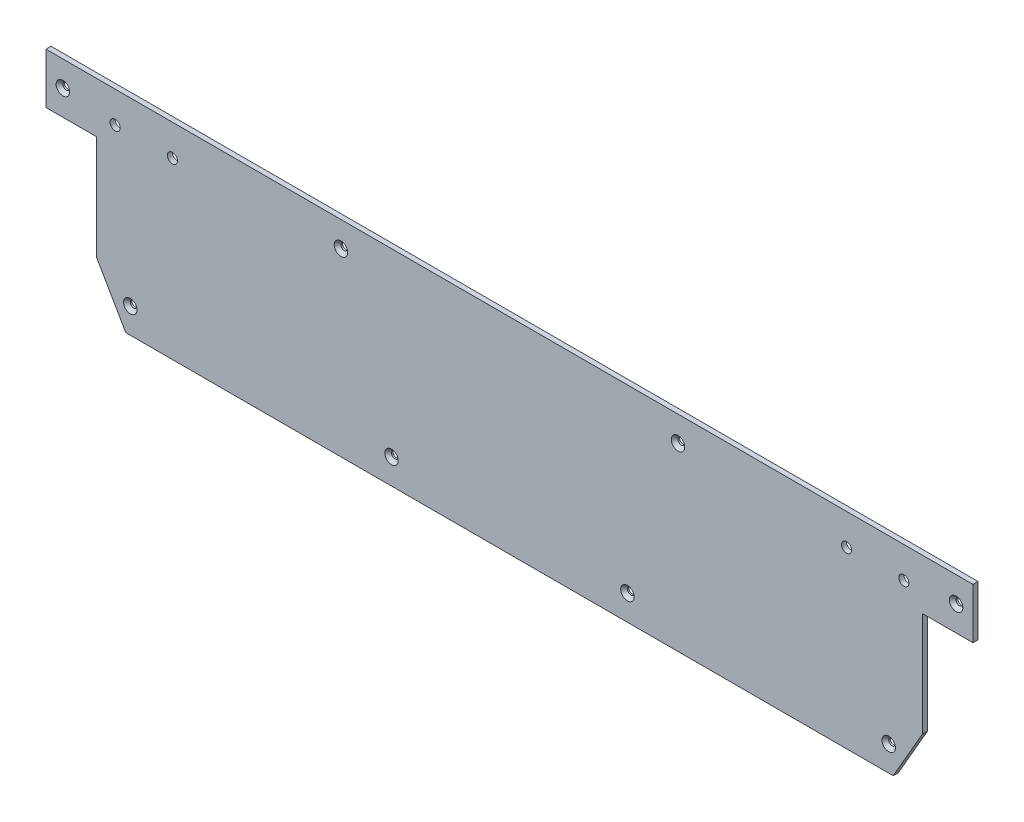
ISO-10303-21;
HEADER;
FILE_DESCRIPTION(('STEP AP214'),'2;1');
FILE_NAME('part.step','',(''),(''),'','','');
FILE_SCHEMA(('AUTOMOTIVE_DESIGN { 1 0 10303 214 1 1 1 1 }'));
ENDSEC;
DATA;
#1=APPLICATION_CONTEXT('core data for automotive mechanical design processes');
#2=APPLICATION_PROTOCOL_DEFINITION('international standard','automotive_design',2000,#1);
#3=PRODUCT_CONTEXT('',#1,'mechanical');
#4=PRODUCT('Part','Part','',(#3));
#5=PRODUCT_RELATED_PRODUCT_CATEGORY('part','',(#4));
#6=PRODUCT_DEFINITION_FORMATION('','',#4);
#7=PRODUCT_DEFINITION_CONTEXT('part definition',#1,'design');
#8=PRODUCT_DEFINITION('design','',#6,#7);
#9=PRODUCT_DEFINITION_SHAPE('','',#8);
#10=(LENGTH_UNIT() NAMED_UNIT(*) SI_UNIT(.MILLI.,.METRE.));
#11=(NAMED_UNIT(*) PLANE_ANGLE_UNIT() SI_UNIT($,.RADIAN.));
#12=(NAMED_UNIT(*) SI_UNIT($,.STERADIAN.) SOLID_ANGLE_UNIT());
#13=UNCERTAINTY_MEASURE_WITH_UNIT(LENGTH_MEASURE(1.E-05),#10,'distance_accuracy_value','');
#14=(GEOMETRIC_REPRESENTATION_CONTEXT(3) GLOBAL_UNCERTAINTY_ASSIGNED_CONTEXT((#13)) GLOBAL_UNIT_ASSIGNED_CONTEXT((#10,
#11,#12)) REPRESENTATION_CONTEXT('',''));
#15=CARTESIAN_POINT('',(0.,0.,0.));
#16=DIRECTION('',(0.,0.,1.));
#17=DIRECTION('',(1.,0.,0.));
#18=AXIS2_PLACEMENT_3D('',#15,#16,#17);
#19=CARTESIAN_POINT('',(-275.,61.,3.));
#20=DIRECTION('',(1.,0.,0.));
#21=DIRECTION('',(0.,0.,-1.));
#22=AXIS2_PLACEMENT_3D('',#19,#20,#21);
#23=PLANE('',#22);
#24=DIRECTION('',(0.,-1.,0.));
#25=VECTOR('',#24,1.);
#26=CARTESIAN_POINT('',(-275.,61.,0.));
#27=LINE('',#26,#25);
#28=CARTESIAN_POINT('',(-275.,61.,0.));
#29=VERTEX_POINT('',#28);
#30=CARTESIAN_POINT('',(-275.,31.,0.));
#31=VERTEX_POINT('',#30);
#32=EDGE_CURVE('E138',#29,#31,#27,.T.);
#33=ORIENTED_EDGE('',*,*,#32,.T.);
#34=DIRECTION('',(0.,0.,1.));
#35=VECTOR('',#34,1.);
#36=CARTESIAN_POINT('',(-275.,31.,0.));
#37=LINE('',#36,#35);
#38=CARTESIAN_POINT('',(-275.,31.,3.));
#39=VERTEX_POINT('',#38);
#40=EDGE_CURVE('E143',#31,#39,#37,.T.);
#41=ORIENTED_EDGE('',*,*,#40,.T.);
#42=DIRECTION('',(0.,-1.,0.));
#43=VECTOR('',#42,1.);
#44=CARTESIAN_POINT('',(-275.,61.,3.));
#45=LINE('',#44,#43);
#46=CARTESIAN_POINT('',(-275.,61.,3.));
#47=VERTEX_POINT('',#46);
#48=EDGE_CURVE('E148',#47,#39,#45,.T.);
#49=ORIENTED_EDGE('',*,*,#48,.F.);
#50=DIRECTION('',(0.,0.,-1.));
#51=VECTOR('',#50,1.);
#52=CARTESIAN_POINT('',(-275.,61.,3.));
#53=LINE('',#52,#51);
#54=EDGE_CURVE('E149',#47,#29,#53,.T.);
#55=ORIENTED_EDGE('',*,*,#54,.T.);
#56=EDGE_LOOP('',(#33,#41,#49,#55));
#57=FACE_BOUND('',#56,.T.);
#58=ADVANCED_FACE('F36',(#57),#23,.F.);
#59=CARTESIAN_POINT('',(-275.,-61.,3.));
#60=DIRECTION('',(0.,1.,0.));
#61=DIRECTION('',(0.,0.,1.));
#62=AXIS2_PLACEMENT_3D('',#59,#60,#61);
#63=PLANE('',#62);
#64=DIRECTION('',(1.,0.,0.));
#65=VECTOR('',#64,1.);
#66=CARTESIAN_POINT('',(-275.,-61.,3.));
#67=LINE('',#66,#65);
#68=CARTESIAN_POINT('',(-227.679491924311,-61.,3.));
#69=VERTEX_POINT('',#68);
#70=CARTESIAN_POINT('',(227.679491924311,-60.9999999999999,3.));
#71=VERTEX_POINT('',#70);
#72=EDGE_CURVE('E131',#69,#71,#67,.T.);
#73=ORIENTED_EDGE('',*,*,#72,.F.);
#74=DIRECTION('',(0.,0.,1.));
#75=VECTOR('',#74,1.);
#76=CARTESIAN_POINT('',(-227.679491924311,-61.,0.));
#77=LINE('',#76,#75);
#78=CARTESIAN_POINT('',(-227.679491924311,-61.,0.));
#79=VERTEX_POINT('',#78);
#80=EDGE_CURVE('E118',#79,#69,#77,.T.);
#81=ORIENTED_EDGE('',*,*,#80,.F.);
#82=DIRECTION('',(1.,0.,0.));
#83=VECTOR('',#82,1.);
#84=CARTESIAN_POINT('',(-275.,-61.,0.));
#85=LINE('',#84,#83);
#86=CARTESIAN_POINT('',(227.679491924311,-61.,0.));
#87=VERTEX_POINT('',#86);
#88=EDGE_CURVE('E129',#79,#87,#85,.T.);
#89=ORIENTED_EDGE('',*,*,#88,.T.);
#90=DIRECTION('',(0.,0.,1.));
#91=VECTOR('',#90,1.);
#92=CARTESIAN_POINT('',(227.679491924311,-60.9999999999999,0.));
#93=LINE('',#92,#91);
#94=EDGE_CURVE('E60',#87,#71,#93,.T.);
#95=ORIENTED_EDGE('',*,*,#94,.T.);
#96=EDGE_LOOP('',(#73,#81,#89,#95));
#97=FACE_BOUND('',#96,.T.);
#98=ADVANCED_FACE('F128',(#97),#63,.F.);
#99=CARTESIAN_POINT('',(275.,61.,3.));
#100=DIRECTION('',(-1.,0.,0.));
#101=DIRECTION('',(0.,0.,1.));
#102=AXIS2_PLACEMENT_3D('',#99,#100,#101);
#103=PLANE('',#102);
#104=DIRECTION('',(0.,1.,0.));
#105=VECTOR('',#104,1.);
#106=CARTESIAN_POINT('',(275.,61.,3.));
#107=LINE('',#106,#105);
#108=CARTESIAN_POINT('',(275.,31.0000000000001,3.));
#109=VERTEX_POINT('',#108);
#110=CARTESIAN_POINT('',(275.,61.,3.));
#111=VERTEX_POINT('',#110);
#112=EDGE_CURVE('E273',#109,#111,#107,.T.);
#113=ORIENTED_EDGE('',*,*,#112,.F.);
#114=DIRECTION('',(0.,0.,1.));
#115=VECTOR('',#114,1.);
#116=CARTESIAN_POINT('',(275.,31.0000000000001,0.));
#117=LINE('',#116,#115);
#118=CARTESIAN_POINT('',(275.,31.0000000000001,0.));
#119=VERTEX_POINT('',#118);
#120=EDGE_CURVE('E267',#119,#109,#117,.T.);
#121=ORIENTED_EDGE('',*,*,#120,.F.);
#122=DIRECTION('',(0.,1.,0.));
#123=VECTOR('',#122,1.);
#124=CARTESIAN_POINT('',(275.,61.,0.));
#125=LINE('',#124,#123);
#126=CARTESIAN_POINT('',(275.,61.,0.));
#127=VERTEX_POINT('',#126);
#128=EDGE_CURVE('E137',#119,#127,#125,.T.);
#129=ORIENTED_EDGE('',*,*,#128,.T.);
#130=DIRECTION('',(0.,0.,-1.));
#131=VECTOR('',#130,1.);
#132=CARTESIAN_POINT('',(275.,61.,3.));
#133=LINE('',#132,#131);
#134=EDGE_CURVE('E152',#111,#127,#133,.T.);
#135=ORIENTED_EDGE('',*,*,#134,.F.);
#136=EDGE_LOOP('',(#113,#121,#129,#135));
#137=FACE_BOUND('',#136,.T.);
#138=ADVANCED_FACE('F298',(#137),#103,.F.);
#139=CARTESIAN_POINT('',(-275.,61.,3.));
#140=DIRECTION('',(0.,-1.,0.));
#141=DIRECTION('',(0.,0.,-1.));
#142=AXIS2_PLACEMENT_3D('',#139,#140,#141);
#143=PLANE('',#142);
#144=DIRECTION('',(-1.,0.,0.));
#145=VECTOR('',#144,1.);
#146=CARTESIAN_POINT('',(-275.,61.,0.));
#147=LINE('',#146,#145);
#148=EDGE_CURVE('E140',#127,#29,#147,.T.);
#149=ORIENTED_EDGE('',*,*,#148,.T.);
#150=ORIENTED_EDGE('',*,*,#54,.F.);
#151=DIRECTION('',(-1.,0.,0.));
#152=VECTOR('',#151,1.);
#153=CARTESIAN_POINT('',(-275.,61.,3.));
#154=LINE('',#153,#152);
#155=EDGE_CURVE('E153',#111,#47,#154,.T.);
#156=ORIENTED_EDGE('',*,*,#155,.F.);
#157=ORIENTED_EDGE('',*,*,#134,.T.);
#158=EDGE_LOOP('',(#149,#150,#156,#157));
#159=FACE_BOUND('',#158,.T.);
#160=ADVANCED_FACE('F212',(#159),#143,.F.);
#161=CARTESIAN_POINT('',(0.,0.,3.));
#162=DIRECTION('',(0.,0.,1.));
#163=DIRECTION('',(1.,0.,0.));
#164=AXIS2_PLACEMENT_3D('',#161,#162,#163);
#165=PLANE('',#164);
#166=CARTESIAN_POINT('',(70.,-46.,3.));
#167=DIRECTION('',(0.,0.,1.));
#168=DIRECTION('',(1.,0.,0.));
#169=AXIS2_PLACEMENT_3D('',#166,#167,#168);
#170=CIRCLE('',#169,3.99999999999989);
#171=CARTESIAN_POINT('',(73.9999999999999,-46.,3.));
#172=VERTEX_POINT('',#171);
#173=EDGE_CURVE('E177',#172,#172,#170,.F.);
#174=ORIENTED_EDGE('',*,*,#173,.T.);
#175=EDGE_LOOP('',(#174));
#176=FACE_BOUND('',#175,.T.);
#177=CARTESIAN_POINT('',(225.,-46.,3.));
#178=DIRECTION('',(0.,0.,1.));
#179=DIRECTION('',(1.,0.,0.));
#180=AXIS2_PLACEMENT_3D('',#177,#178,#179);
#181=CIRCLE('',#180,4.);
#182=CARTESIAN_POINT('',(229.,-46.,3.));
#183=VERTEX_POINT('',#182);
#184=EDGE_CURVE('E174',#183,#183,#181,.F.);
#185=ORIENTED_EDGE('',*,*,#184,.T.);
#186=EDGE_LOOP('',(#185));
#187=FACE_BOUND('',#186,.T.);
#188=CARTESIAN_POINT('',(265.,46.,3.));
#189=DIRECTION('',(0.,0.,1.));
#190=DIRECTION('',(1.,0.,0.));
#191=AXIS2_PLACEMENT_3D('',#188,#189,#190);
#192=CIRCLE('',#191,3.99999999999984);
#193=CARTESIAN_POINT('',(269.,46.,3.));
#194=VERTEX_POINT('',#193);
#195=EDGE_CURVE('E171',#194,#194,#192,.F.);
#196=ORIENTED_EDGE('',*,*,#195,.T.);
#197=EDGE_LOOP('',(#196));
#198=FACE_BOUND('',#197,.T.);
#199=CARTESIAN_POINT('',(100.,46.,3.));
#200=DIRECTION('',(0.,0.,1.));
#201=DIRECTION('',(1.,0.,0.));
#202=AXIS2_PLACEMENT_3D('',#199,#200,#201);
#203=CIRCLE('',#202,4.00000000000006);
#204=CARTESIAN_POINT('',(104.,46.,3.));
#205=VERTEX_POINT('',#204);
#206=EDGE_CURVE('E168',#205,#205,#203,.F.);
#207=ORIENTED_EDGE('',*,*,#206,.T.);
#208=EDGE_LOOP('',(#207));
#209=FACE_BOUND('',#208,.T.);
#210=CARTESIAN_POINT('',(-225.,-46.,3.));
#211=DIRECTION('',(0.,0.,1.));
#212=DIRECTION('',(1.,0.,0.));
#213=AXIS2_PLACEMENT_3D('',#210,#211,#212);
#214=CIRCLE('',#213,4.);
#215=CARTESIAN_POINT('',(-221.,-46.,3.));
#216=VERTEX_POINT('',#215);
#217=EDGE_CURVE('E165',#216,#216,#214,.F.);
#218=ORIENTED_EDGE('',*,*,#217,.T.);
#219=EDGE_LOOP('',(#218));
#220=FACE_BOUND('',#219,.T.);
#221=CARTESIAN_POINT('',(-70.,-46.,3.));
#222=DIRECTION('',(0.,0.,1.));
#223=DIRECTION('',(1.,0.,0.));
#224=AXIS2_PLACEMENT_3D('',#221,#222,#223);
#225=CIRCLE('',#224,3.99999999999989);
#226=CARTESIAN_POINT('',(-66.0000000000001,-46.,3.));
#227=VERTEX_POINT('',#226);
#228=EDGE_CURVE('E162',#227,#227,#225,.F.);
#229=ORIENTED_EDGE('',*,*,#228,.T.);
#230=EDGE_LOOP('',(#229));
#231=FACE_BOUND('',#230,.T.);
#232=CARTESIAN_POINT('',(-100.,46.,3.));
#233=DIRECTION('',(0.,0.,1.));
#234=DIRECTION('',(1.,0.,0.));
#235=AXIS2_PLACEMENT_3D('',#232,#233,#234);
#236=CIRCLE('',#235,4.00000000000006);
#237=CARTESIAN_POINT('',(-95.9999999999999,46.,3.));
#238=VERTEX_POINT('',#237);
#239=EDGE_CURVE('E159',#238,#238,#236,.F.);
#240=ORIENTED_EDGE('',*,*,#239,.T.);
#241=EDGE_LOOP('',(#240));
#242=FACE_BOUND('',#241,.T.);
#243=CARTESIAN_POINT('',(-265.,46.,3.));
#244=DIRECTION('',(0.,0.,1.));
#245=DIRECTION('',(1.,0.,0.));
#246=AXIS2_PLACEMENT_3D('',#243,#244,#245);
#247=CIRCLE('',#246,4.);
#248=CARTESIAN_POINT('',(-261.,46.,3.));
#249=VERTEX_POINT('',#248);
#250=EDGE_CURVE('E156',#249,#249,#247,.F.);
#251=ORIENTED_EDGE('',*,*,#250,.T.);
#252=EDGE_LOOP('',(#251));
#253=FACE_BOUND('',#252,.T.);
#254=CARTESIAN_POINT('',(-234.,42.5,3.));
#255=DIRECTION('',(0.,0.,1.));
#256=DIRECTION('',(1.,0.,0.));
#257=AXIS2_PLACEMENT_3D('',#254,#255,#256);
#258=CIRCLE('',#257,2.99999999999999);
#259=CARTESIAN_POINT('',(-231.,42.5,3.));
#260=VERTEX_POINT('',#259);
#261=EDGE_CURVE('E220',#260,#260,#258,.F.);
#262=ORIENTED_EDGE('',*,*,#261,.T.);
#263=EDGE_LOOP('',(#262));
#264=FACE_BOUND('',#263,.T.);
#265=CARTESIAN_POINT('',(234.,42.5,3.));
#266=DIRECTION('',(0.,0.,1.));
#267=DIRECTION('',(1.,0.,0.));
#268=AXIS2_PLACEMENT_3D('',#265,#266,#267);
#269=CIRCLE('',#268,2.99999999999999);
#270=CARTESIAN_POINT('',(237.,42.5,3.));
#271=VERTEX_POINT('',#270);
#272=EDGE_CURVE('E224',#271,#271,#269,.F.);
#273=ORIENTED_EDGE('',*,*,#272,.T.);
#274=EDGE_LOOP('',(#273));
#275=FACE_BOUND('',#274,.T.);
#276=CARTESIAN_POINT('',(200.,42.5,3.));
#277=DIRECTION('',(0.,0.,1.));
#278=DIRECTION('',(1.,0.,0.));
#279=AXIS2_PLACEMENT_3D('',#276,#277,#278);
#280=CIRCLE('',#279,2.99999999999999);
#281=CARTESIAN_POINT('',(203.,42.5,3.));
#282=VERTEX_POINT('',#281);
#283=EDGE_CURVE('E228',#282,#282,#280,.F.);
#284=ORIENTED_EDGE('',*,*,#283,.T.);
#285=EDGE_LOOP('',(#284));
#286=FACE_BOUND('',#285,.T.);
#287=CARTESIAN_POINT('',(-200.,42.5,3.));
#288=DIRECTION('',(0.,0.,1.));
#289=DIRECTION('',(1.,0.,0.));
#290=AXIS2_PLACEMENT_3D('',#287,#288,#289);
#291=CIRCLE('',#290,2.99999999999999);
#292=CARTESIAN_POINT('',(-197.,42.5,3.));
#293=VERTEX_POINT('',#292);
#294=EDGE_CURVE('E232',#293,#293,#291,.F.);
#295=ORIENTED_EDGE('',*,*,#294,.T.);
#296=EDGE_LOOP('',(#295));
#297=FACE_BOUND('',#296,.T.);
#298=DIRECTION('',(-1.,0.,0.));
#299=VECTOR('',#298,1.);
#300=CARTESIAN_POINT('',(-275.,31.,3.));
#301=LINE('',#300,#299);
#302=CARTESIAN_POINT('',(-245.,31.,3.));
#303=VERTEX_POINT('',#302);
#304=EDGE_CURVE('E123',#303,#39,#301,.T.);
#305=ORIENTED_EDGE('',*,*,#304,.F.);
#306=DIRECTION('',(0.,1.,0.));
#307=VECTOR('',#306,1.);
#308=CARTESIAN_POINT('',(-245.,31.,3.));
#309=LINE('',#308,#307);
#310=CARTESIAN_POINT('',(-245.,-31.,3.));
#311=VERTEX_POINT('',#310);
#312=EDGE_CURVE('E237',#311,#303,#309,.T.);
#313=ORIENTED_EDGE('',*,*,#312,.F.);
#314=DIRECTION('',(-0.499999999999998,0.86602540378444,0.));
#315=VECTOR('',#314,1.);
#316=CARTESIAN_POINT('',(-245.,-31.,3.));
#317=LINE('',#316,#315);
#318=EDGE_CURVE('E242',#69,#311,#317,.T.);
#319=ORIENTED_EDGE('',*,*,#318,.F.);
#320=ORIENTED_EDGE('',*,*,#72,.T.);
#321=DIRECTION('',(-0.499999999999996,-0.866025403784441,0.));
#322=VECTOR('',#321,1.);
#323=CARTESIAN_POINT('',(245.,-30.9999999999999,3.));
#324=LINE('',#323,#322);
#325=CARTESIAN_POINT('',(245.,-30.9999999999999,3.));
#326=VERTEX_POINT('',#325);
#327=EDGE_CURVE('E261',#326,#71,#324,.T.);
#328=ORIENTED_EDGE('',*,*,#327,.F.);
#329=DIRECTION('',(0.,-1.,0.));
#330=VECTOR('',#329,1.);
#331=CARTESIAN_POINT('',(245.,31.0000000000001,3.));
#332=LINE('',#331,#330);
#333=CARTESIAN_POINT('',(245.,31.0000000000001,3.));
#334=VERTEX_POINT('',#333);
#335=EDGE_CURVE('E258',#334,#326,#332,.T.);
#336=ORIENTED_EDGE('',*,*,#335,.F.);
#337=DIRECTION('',(-1.,0.,0.));
#338=VECTOR('',#337,1.);
#339=CARTESIAN_POINT('',(275.,31.0000000000001,3.));
#340=LINE('',#339,#338);
#341=EDGE_CURVE('E252',#109,#334,#340,.T.);
#342=ORIENTED_EDGE('',*,*,#341,.F.);
#343=ORIENTED_EDGE('',*,*,#112,.T.);
#344=ORIENTED_EDGE('',*,*,#155,.T.);
#345=ORIENTED_EDGE('',*,*,#48,.T.);
#346=EDGE_LOOP('',(#305,#313,#319,#320,#328,#336,#342,#343,#344,#345));
#347=FACE_BOUND('',#346,.T.);
#348=ADVANCED_FACE('F209',(#176,#187,#198,#209,#220,#231,#242,#253,#264,#275,#286,#297,#347),
#165,.T.);
#349=CARTESIAN_POINT('',(0.,0.,0.));
#350=DIRECTION('',(0.,0.,1.));
#351=DIRECTION('',(1.,0.,0.));
#352=AXIS2_PLACEMENT_3D('',#349,#350,#351);
#353=PLANE('',#352);
#354=CARTESIAN_POINT('',(225.,-46.,0.));
#355=DIRECTION('',(0.,0.,1.));
#356=DIRECTION('',(-1.,0.,0.));
#357=AXIS2_PLACEMENT_3D('',#354,#355,#356);
#358=CIRCLE('',#357,2.);
#359=CARTESIAN_POINT('',(223.,-46.,0.));
#360=VERTEX_POINT('',#359);
#361=EDGE_CURVE('E376',#360,#360,#358,.T.);
#362=ORIENTED_EDGE('',*,*,#361,.T.);
#363=EDGE_LOOP('',(#362));
#364=FACE_BOUND('',#363,.T.);
#365=CARTESIAN_POINT('',(-70.,-46.,0.));
#366=DIRECTION('',(0.,0.,1.));
#367=DIRECTION('',(1.,0.,0.));
#368=AXIS2_PLACEMENT_3D('',#365,#366,#367);
#369=CIRCLE('',#368,2.);
#370=CARTESIAN_POINT('',(-68.,-46.,0.));
#371=VERTEX_POINT('',#370);
#372=EDGE_CURVE('E373',#371,#371,#369,.T.);
#373=ORIENTED_EDGE('',*,*,#372,.T.);
#374=EDGE_LOOP('',(#373));
#375=FACE_BOUND('',#374,.T.);
#376=CARTESIAN_POINT('',(-225.,-46.,0.));
#377=DIRECTION('',(0.,0.,1.));
#378=DIRECTION('',(1.,0.,0.));
#379=AXIS2_PLACEMENT_3D('',#376,#377,#378);
#380=CIRCLE('',#379,2.);
#381=CARTESIAN_POINT('',(-223.,-46.,0.));
#382=VERTEX_POINT('',#381);
#383=EDGE_CURVE('E375',#382,#382,#380,.T.);
#384=ORIENTED_EDGE('',*,*,#383,.T.);
#385=EDGE_LOOP('',(#384));
#386=FACE_BOUND('',#385,.T.);
#387=CARTESIAN_POINT('',(-100.,46.,0.));
#388=DIRECTION('',(0.,0.,1.));
#389=DIRECTION('',(1.,0.,0.));
#390=AXIS2_PLACEMENT_3D('',#387,#388,#389);
#391=CIRCLE('',#390,2.);
#392=CARTESIAN_POINT('',(-98.,46.,0.));
#393=VERTEX_POINT('',#392);
#394=EDGE_CURVE('E379',#393,#393,#391,.T.);
#395=ORIENTED_EDGE('',*,*,#394,.T.);
#396=EDGE_LOOP('',(#395));
#397=FACE_BOUND('',#396,.T.);
#398=CARTESIAN_POINT('',(-234.,42.5,0.));
#399=DIRECTION('',(0.,0.,1.));
#400=DIRECTION('',(1.,0.,0.));
#401=AXIS2_PLACEMENT_3D('',#398,#399,#400);
#402=CIRCLE('',#401,2.99999999999999);
#403=CARTESIAN_POINT('',(-231.,42.5,0.));
#404=VERTEX_POINT('',#403);
#405=EDGE_CURVE('E393',#404,#404,#402,.T.);
#406=ORIENTED_EDGE('',*,*,#405,.T.);
#407=EDGE_LOOP('',(#406));
#408=FACE_BOUND('',#407,.T.);
#409=CARTESIAN_POINT('',(234.,42.5,0.));
#410=DIRECTION('',(0.,0.,1.));
#411=DIRECTION('',(-1.,0.,0.));
#412=AXIS2_PLACEMENT_3D('',#409,#410,#411);
#413=CIRCLE('',#412,2.99999999999999);
#414=CARTESIAN_POINT('',(231.,42.5,0.));
#415=VERTEX_POINT('',#414);
#416=EDGE_CURVE('E389',#415,#415,#413,.T.);
#417=ORIENTED_EDGE('',*,*,#416,.T.);
#418=EDGE_LOOP('',(#417));
#419=FACE_BOUND('',#418,.T.);
#420=CARTESIAN_POINT('',(200.,42.5,0.));
#421=DIRECTION('',(0.,0.,1.));
#422=DIRECTION('',(-1.,0.,0.));
#423=AXIS2_PLACEMENT_3D('',#420,#421,#422);
#424=CIRCLE('',#423,2.99999999999999);
#425=CARTESIAN_POINT('',(197.,42.5,0.));
#426=VERTEX_POINT('',#425);
#427=EDGE_CURVE('E386',#426,#426,#424,.T.);
#428=ORIENTED_EDGE('',*,*,#427,.T.);
#429=EDGE_LOOP('',(#428));
#430=FACE_BOUND('',#429,.T.);
#431=CARTESIAN_POINT('',(-265.,46.,0.));
#432=DIRECTION('',(0.,0.,1.));
#433=DIRECTION('',(1.,0.,0.));
#434=AXIS2_PLACEMENT_3D('',#431,#432,#433);
#435=CIRCLE('',#434,2.);
#436=CARTESIAN_POINT('',(-263.,46.,0.));
#437=VERTEX_POINT('',#436);
#438=EDGE_CURVE('E390',#437,#437,#435,.T.);
#439=ORIENTED_EDGE('',*,*,#438,.T.);
#440=EDGE_LOOP('',(#439));
#441=FACE_BOUND('',#440,.T.);
#442=CARTESIAN_POINT('',(70.,-46.,0.));
#443=DIRECTION('',(0.,0.,1.));
#444=DIRECTION('',(-1.,0.,0.));
#445=AXIS2_PLACEMENT_3D('',#442,#443,#444);
#446=CIRCLE('',#445,2.);
#447=CARTESIAN_POINT('',(68.,-46.,0.));
#448=VERTEX_POINT('',#447);
#449=EDGE_CURVE('E382',#448,#448,#446,.T.);
#450=ORIENTED_EDGE('',*,*,#449,.T.);
#451=EDGE_LOOP('',(#450));
#452=FACE_BOUND('',#451,.T.);
#453=CARTESIAN_POINT('',(100.,46.,0.));
#454=DIRECTION('',(0.,0.,1.));
#455=DIRECTION('',(-1.,0.,0.));
#456=AXIS2_PLACEMENT_3D('',#453,#454,#455);
#457=CIRCLE('',#456,2.);
#458=CARTESIAN_POINT('',(98.,46.,0.));
#459=VERTEX_POINT('',#458);
#460=EDGE_CURVE('E460',#459,#459,#457,.T.);
#461=ORIENTED_EDGE('',*,*,#460,.T.);
#462=EDGE_LOOP('',(#461));
#463=FACE_BOUND('',#462,.T.);
#464=CARTESIAN_POINT('',(265.,46.,0.));
#465=DIRECTION('',(0.,0.,1.));
#466=DIRECTION('',(-1.,0.,0.));
#467=AXIS2_PLACEMENT_3D('',#464,#465,#466);
#468=CIRCLE('',#467,2.);
#469=CARTESIAN_POINT('',(263.,46.,0.));
#470=VERTEX_POINT('',#469);
#471=EDGE_CURVE('E463',#470,#470,#468,.T.);
#472=ORIENTED_EDGE('',*,*,#471,.T.);
#473=EDGE_LOOP('',(#472));
#474=FACE_BOUND('',#473,.T.);
#475=CARTESIAN_POINT('',(-200.,42.5,0.));
#476=DIRECTION('',(0.,0.,1.));
#477=DIRECTION('',(1.,0.,0.));
#478=AXIS2_PLACEMENT_3D('',#475,#476,#477);
#479=CIRCLE('',#478,2.99999999999999);
#480=CARTESIAN_POINT('',(-197.,42.5,0.));
#481=VERTEX_POINT('',#480);
#482=EDGE_CURVE('E396',#481,#481,#479,.T.);
#483=ORIENTED_EDGE('',*,*,#482,.T.);
#484=EDGE_LOOP('',(#483));
#485=FACE_BOUND('',#484,.T.);
#486=DIRECTION('',(0.,1.,0.));
#487=VECTOR('',#486,1.);
#488=CARTESIAN_POINT('',(-245.,31.,0.));
#489=LINE('',#488,#487);
#490=CARTESIAN_POINT('',(-245.,-31.,0.));
#491=VERTEX_POINT('',#490);
#492=CARTESIAN_POINT('',(-245.,31.,0.));
#493=VERTEX_POINT('',#492);
#494=EDGE_CURVE('E52',#491,#493,#489,.T.);
#495=ORIENTED_EDGE('',*,*,#494,.T.);
#496=DIRECTION('',(-1.,0.,0.));
#497=VECTOR('',#496,1.);
#498=CARTESIAN_POINT('',(-275.,31.,0.));
#499=LINE('',#498,#497);
#500=EDGE_CURVE('E132',#493,#31,#499,.T.);
#501=ORIENTED_EDGE('',*,*,#500,.T.);
#502=ORIENTED_EDGE('',*,*,#32,.F.);
#503=ORIENTED_EDGE('',*,*,#148,.F.);
#504=ORIENTED_EDGE('',*,*,#128,.F.);
#505=DIRECTION('',(-1.,0.,0.));
#506=VECTOR('',#505,1.);
#507=CARTESIAN_POINT('',(275.,31.0000000000001,0.));
#508=LINE('',#507,#506);
#509=CARTESIAN_POINT('',(245.,31.0000000000001,0.));
#510=VERTEX_POINT('',#509);
#511=EDGE_CURVE('E254',#119,#510,#508,.T.);
#512=ORIENTED_EDGE('',*,*,#511,.T.);
#513=DIRECTION('',(0.,-1.,0.));
#514=VECTOR('',#513,1.);
#515=CARTESIAN_POINT('',(245.,31.0000000000001,0.));
#516=LINE('',#515,#514);
#517=CARTESIAN_POINT('',(245.,-30.9999999999999,0.));
#518=VERTEX_POINT('',#517);
#519=EDGE_CURVE('E250',#510,#518,#516,.T.);
#520=ORIENTED_EDGE('',*,*,#519,.T.);
#521=DIRECTION('',(-0.499999999999996,-0.866025403784441,0.));
#522=VECTOR('',#521,1.);
#523=CARTESIAN_POINT('',(245.,-30.9999999999999,0.));
#524=LINE('',#523,#522);
#525=EDGE_CURVE('E136',#518,#87,#524,.T.);
#526=ORIENTED_EDGE('',*,*,#525,.T.);
#527=ORIENTED_EDGE('',*,*,#88,.F.);
#528=DIRECTION('',(-0.499999999999998,0.86602540378444,0.));
#529=VECTOR('',#528,1.);
#530=CARTESIAN_POINT('',(-245.,-31.,0.));
#531=LINE('',#530,#529);
#532=EDGE_CURVE('E114',#79,#491,#531,.T.);
#533=ORIENTED_EDGE('',*,*,#532,.T.);
#534=EDGE_LOOP('',(#495,#501,#502,#503,#504,#512,#520,#526,#527,#533));
#535=FACE_BOUND('',#534,.T.);
#536=ADVANCED_FACE('F134',(#364,#375,#386,#397,#408,#419,#430,#441,#452,#463,#474,#485,#535),
#353,.F.);
#537=CARTESIAN_POINT('',(245.,31.0000000000001,0.));
#538=DIRECTION('',(-1.,0.,0.));
#539=DIRECTION('',(0.,0.,1.));
#540=AXIS2_PLACEMENT_3D('',#537,#538,#539);
#541=PLANE('',#540);
#542=ORIENTED_EDGE('',*,*,#335,.T.);
#543=DIRECTION('',(0.,0.,1.));
#544=VECTOR('',#543,1.);
#545=CARTESIAN_POINT('',(245.,-30.9999999999999,0.));
#546=LINE('',#545,#544);
#547=EDGE_CURVE('E257',#518,#326,#546,.T.);
#548=ORIENTED_EDGE('',*,*,#547,.F.);
#549=ORIENTED_EDGE('',*,*,#519,.F.);
#550=DIRECTION('',(0.,0.,1.));
#551=VECTOR('',#550,1.);
#552=CARTESIAN_POINT('',(245.,31.0000000000001,0.));
#553=LINE('',#552,#551);
#554=EDGE_CURVE('E265',#510,#334,#553,.T.);
#555=ORIENTED_EDGE('',*,*,#554,.T.);
#556=EDGE_LOOP('',(#542,#548,#549,#555));
#557=FACE_BOUND('',#556,.T.);
#558=ADVANCED_FACE('F293',(#557),#541,.F.);
#559=CARTESIAN_POINT('',(275.,31.0000000000001,0.));
#560=DIRECTION('',(0.,1.,0.));
#561=DIRECTION('',(-1.,0.,0.));
#562=AXIS2_PLACEMENT_3D('',#559,#560,#561);
#563=PLANE('',#562);
#564=ORIENTED_EDGE('',*,*,#341,.T.);
#565=ORIENTED_EDGE('',*,*,#554,.F.);
#566=ORIENTED_EDGE('',*,*,#511,.F.);
#567=ORIENTED_EDGE('',*,*,#120,.T.);
#568=EDGE_LOOP('',(#564,#565,#566,#567));
#569=FACE_BOUND('',#568,.T.);
#570=ADVANCED_FACE('F295',(#569),#563,.F.);
#571=CARTESIAN_POINT('',(245.,-30.9999999999999,0.));
#572=DIRECTION('',(-0.866025403784441,0.499999999999996,0.));
#573=DIRECTION('',(-0.499999999999996,-0.866025403784441,0.));
#574=AXIS2_PLACEMENT_3D('',#571,#572,#573);
#575=PLANE('',#574);
#576=ORIENTED_EDGE('',*,*,#327,.T.);
#577=ORIENTED_EDGE('',*,*,#94,.F.);
#578=ORIENTED_EDGE('',*,*,#525,.F.);
#579=ORIENTED_EDGE('',*,*,#547,.T.);
#580=EDGE_LOOP('',(#576,#577,#578,#579));
#581=FACE_BOUND('',#580,.T.);
#582=ADVANCED_FACE('F290',(#581),#575,.F.);
#583=CARTESIAN_POINT('',(-275.,31.,0.));
#584=DIRECTION('',(0.,1.,0.));
#585=DIRECTION('',(-1.,0.,0.));
#586=AXIS2_PLACEMENT_3D('',#583,#584,#585);
#587=PLANE('',#586);
#588=ORIENTED_EDGE('',*,*,#304,.T.);
#589=ORIENTED_EDGE('',*,*,#40,.F.);
#590=ORIENTED_EDGE('',*,*,#500,.F.);
#591=DIRECTION('',(0.,0.,1.));
#592=VECTOR('',#591,1.);
#593=CARTESIAN_POINT('',(-245.,31.,0.));
#594=LINE('',#593,#592);
#595=EDGE_CURVE('E247',#493,#303,#594,.T.);
#596=ORIENTED_EDGE('',*,*,#595,.T.);
#597=EDGE_LOOP('',(#588,#589,#590,#596));
#598=FACE_BOUND('',#597,.T.);
#599=ADVANCED_FACE('F285',(#598),#587,.F.);
#600=CARTESIAN_POINT('',(-245.,31.,0.));
#601=DIRECTION('',(1.,0.,0.));
#602=DIRECTION('',(0.,0.,-1.));
#603=AXIS2_PLACEMENT_3D('',#600,#601,#602);
#604=PLANE('',#603);
#605=ORIENTED_EDGE('',*,*,#312,.T.);
#606=ORIENTED_EDGE('',*,*,#595,.F.);
#607=ORIENTED_EDGE('',*,*,#494,.F.);
#608=DIRECTION('',(0.,0.,1.));
#609=VECTOR('',#608,1.);
#610=CARTESIAN_POINT('',(-245.,-31.,0.));
#611=LINE('',#610,#609);
#612=EDGE_CURVE('E120',#491,#311,#611,.T.);
#613=ORIENTED_EDGE('',*,*,#612,.T.);
#614=EDGE_LOOP('',(#605,#606,#607,#613));
#615=FACE_BOUND('',#614,.T.);
#616=ADVANCED_FACE('F419',(#615),#604,.F.);
#617=CARTESIAN_POINT('',(-245.,-31.,0.));
#618=DIRECTION('',(0.86602540378444,0.499999999999998,0.));
#619=DIRECTION('',(-0.499999999999998,0.86602540378444,0.));
#620=AXIS2_PLACEMENT_3D('',#617,#618,#619);
#621=PLANE('',#620);
#622=ORIENTED_EDGE('',*,*,#318,.T.);
#623=ORIENTED_EDGE('',*,*,#612,.F.);
#624=ORIENTED_EDGE('',*,*,#532,.F.);
#625=ORIENTED_EDGE('',*,*,#80,.T.);
#626=EDGE_LOOP('',(#622,#623,#624,#625));
#627=FACE_BOUND('',#626,.T.);
#628=ADVANCED_FACE('F117',(#627),#621,.F.);
#629=CARTESIAN_POINT('',(-200.,42.5,10.));
#630=DIRECTION('',(0.,0.,-1.));
#631=DIRECTION('',(-1.,0.,0.));
#632=AXIS2_PLACEMENT_3D('',#629,#630,#631);
#633=CYLINDRICAL_SURFACE('',#632,2.99999999999999);
#634=ORIENTED_EDGE('',*,*,#294,.F.);
#635=EDGE_LOOP('',(#634));
#636=FACE_BOUND('',#635,.T.);
#637=ORIENTED_EDGE('',*,*,#482,.F.);
#638=EDGE_LOOP('',(#637));
#639=FACE_BOUND('',#638,.T.);
#640=ADVANCED_FACE('F407',(#636,#639),#633,.F.);
#641=CARTESIAN_POINT('',(265.,46.,10.));
#642=DIRECTION('',(0.,0.,-1.));
#643=DIRECTION('',(-1.,0.,0.));
#644=AXIS2_PLACEMENT_3D('',#641,#642,#643);
#645=CYLINDRICAL_SURFACE('',#644,2.);
#646=CARTESIAN_POINT('',(265.,46.,1.00000000000015));
#647=DIRECTION('',(0.,0.,1.));
#648=DIRECTION('',(1.,0.,0.));
#649=AXIS2_PLACEMENT_3D('',#646,#647,#648);
#650=CIRCLE('',#649,2.);
#651=CARTESIAN_POINT('',(267.,46.,1.00000000000015));
#652=VERTEX_POINT('',#651);
#653=EDGE_CURVE('E186',#652,#652,#650,.T.);
#654=ORIENTED_EDGE('',*,*,#653,.T.);
#655=EDGE_LOOP('',(#654));
#656=FACE_BOUND('',#655,.T.);
#657=ORIENTED_EDGE('',*,*,#471,.F.);
#658=EDGE_LOOP('',(#657));
#659=FACE_BOUND('',#658,.T.);
#660=ADVANCED_FACE('F409',(#656,#659),#645,.F.);
#661=CARTESIAN_POINT('',(100.,46.,10.));
#662=DIRECTION('',(0.,0.,-1.));
#663=DIRECTION('',(-1.,0.,0.));
#664=AXIS2_PLACEMENT_3D('',#661,#662,#663);
#665=CYLINDRICAL_SURFACE('',#664,2.);
#666=CARTESIAN_POINT('',(100.,46.,0.999999999999902));
#667=DIRECTION('',(0.,0.,1.));
#668=DIRECTION('',(1.,0.,0.));
#669=AXIS2_PLACEMENT_3D('',#666,#667,#668);
#670=CIRCLE('',#669,2.);
#671=CARTESIAN_POINT('',(102.,46.,0.999999999999902));
#672=VERTEX_POINT('',#671);
#673=EDGE_CURVE('E189',#672,#672,#670,.T.);
#674=ORIENTED_EDGE('',*,*,#673,.T.);
#675=EDGE_LOOP('',(#674));
#676=FACE_BOUND('',#675,.T.);
#677=ORIENTED_EDGE('',*,*,#460,.F.);
#678=EDGE_LOOP('',(#677));
#679=FACE_BOUND('',#678,.T.);
#680=ADVANCED_FACE('F416',(#676,#679),#665,.F.);
#681=CARTESIAN_POINT('',(70.,-46.,10.));
#682=DIRECTION('',(0.,0.,-1.));
#683=DIRECTION('',(-1.,0.,0.));
#684=AXIS2_PLACEMENT_3D('',#681,#682,#683);
#685=CYLINDRICAL_SURFACE('',#684,2.);
#686=CARTESIAN_POINT('',(70.,-46.,1.00000000000007));
#687=DIRECTION('',(0.,0.,1.));
#688=DIRECTION('',(1.,0.,0.));
#689=AXIS2_PLACEMENT_3D('',#686,#687,#688);
#690=CIRCLE('',#689,2.);
#691=CARTESIAN_POINT('',(72.,-46.,1.00000000000007));
#692=VERTEX_POINT('',#691);
#693=EDGE_CURVE('E180',#692,#692,#690,.T.);
#694=ORIENTED_EDGE('',*,*,#693,.T.);
#695=EDGE_LOOP('',(#694));
#696=FACE_BOUND('',#695,.T.);
#697=ORIENTED_EDGE('',*,*,#449,.F.);
#698=EDGE_LOOP('',(#697));
#699=FACE_BOUND('',#698,.T.);
#700=ADVANCED_FACE('F470',(#696,#699),#685,.F.);
#701=CARTESIAN_POINT('',(-265.,46.,10.));
#702=DIRECTION('',(0.,0.,-1.));
#703=DIRECTION('',(-1.,0.,0.));
#704=AXIS2_PLACEMENT_3D('',#701,#702,#703);
#705=CYLINDRICAL_SURFACE('',#704,2.);
#706=CARTESIAN_POINT('',(-265.,46.,0.999999999999985));
#707=DIRECTION('',(0.,0.,1.));
#708=DIRECTION('',(1.,0.,0.));
#709=AXIS2_PLACEMENT_3D('',#706,#707,#708);
#710=CIRCLE('',#709,2.);
#711=CARTESIAN_POINT('',(-263.,46.,0.999999999999985));
#712=VERTEX_POINT('',#711);
#713=EDGE_CURVE('E11',#712,#712,#710,.T.);
#714=ORIENTED_EDGE('',*,*,#713,.T.);
#715=EDGE_LOOP('',(#714));
#716=FACE_BOUND('',#715,.T.);
#717=ORIENTED_EDGE('',*,*,#438,.F.);
#718=EDGE_LOOP('',(#717));
#719=FACE_BOUND('',#718,.T.);
#720=ADVANCED_FACE('F476',(#716,#719),#705,.F.);
#721=CARTESIAN_POINT('',(200.,42.5,10.));
#722=DIRECTION('',(0.,0.,-1.));
#723=DIRECTION('',(-1.,0.,0.));
#724=AXIS2_PLACEMENT_3D('',#721,#722,#723);
#725=CYLINDRICAL_SURFACE('',#724,2.99999999999999);
#726=ORIENTED_EDGE('',*,*,#283,.F.);
#727=EDGE_LOOP('',(#726));
#728=FACE_BOUND('',#727,.T.);
#729=ORIENTED_EDGE('',*,*,#427,.F.);
#730=EDGE_LOOP('',(#729));
#731=FACE_BOUND('',#730,.T.);
#732=ADVANCED_FACE('F489',(#728,#731),#725,.F.);
#733=CARTESIAN_POINT('',(234.,42.5,10.));
#734=DIRECTION('',(0.,0.,-1.));
#735=DIRECTION('',(-1.,0.,0.));
#736=AXIS2_PLACEMENT_3D('',#733,#734,#735);
#737=CYLINDRICAL_SURFACE('',#736,2.99999999999999);
#738=ORIENTED_EDGE('',*,*,#272,.F.);
#739=EDGE_LOOP('',(#738));
#740=FACE_BOUND('',#739,.T.);
#741=ORIENTED_EDGE('',*,*,#416,.F.);
#742=EDGE_LOOP('',(#741));
#743=FACE_BOUND('',#742,.T.);
#744=ADVANCED_FACE('F423',(#740,#743),#737,.F.);
#745=CARTESIAN_POINT('',(-234.,42.5,10.));
#746=DIRECTION('',(0.,0.,-1.));
#747=DIRECTION('',(-1.,0.,0.));
#748=AXIS2_PLACEMENT_3D('',#745,#746,#747);
#749=CYLINDRICAL_SURFACE('',#748,2.99999999999999);
#750=ORIENTED_EDGE('',*,*,#261,.F.);
#751=EDGE_LOOP('',(#750));
#752=FACE_BOUND('',#751,.T.);
#753=ORIENTED_EDGE('',*,*,#405,.F.);
#754=EDGE_LOOP('',(#753));
#755=FACE_BOUND('',#754,.T.);
#756=ADVANCED_FACE('F482',(#752,#755),#749,.F.);
#757=CARTESIAN_POINT('',(-100.,46.,10.));
#758=DIRECTION('',(0.,0.,-1.));
#759=DIRECTION('',(-1.,0.,0.));
#760=AXIS2_PLACEMENT_3D('',#757,#758,#759);
#761=CYLINDRICAL_SURFACE('',#760,2.);
#762=CARTESIAN_POINT('',(-100.,46.,0.999999999999902));
#763=DIRECTION('',(0.,0.,1.));
#764=DIRECTION('',(1.,0.,0.));
#765=AXIS2_PLACEMENT_3D('',#762,#763,#764);
#766=CIRCLE('',#765,2.);
#767=CARTESIAN_POINT('',(-98.,46.,0.999999999999902));
#768=VERTEX_POINT('',#767);
#769=EDGE_CURVE('E45',#768,#768,#766,.T.);
#770=ORIENTED_EDGE('',*,*,#769,.T.);
#771=EDGE_LOOP('',(#770));
#772=FACE_BOUND('',#771,.T.);
#773=ORIENTED_EDGE('',*,*,#394,.F.);
#774=EDGE_LOOP('',(#773));
#775=FACE_BOUND('',#774,.T.);
#776=ADVANCED_FACE('F200',(#772,#775),#761,.F.);
#777=CARTESIAN_POINT('',(-225.,-46.,10.));
#778=DIRECTION('',(0.,0.,-1.));
#779=DIRECTION('',(-1.,0.,0.));
#780=AXIS2_PLACEMENT_3D('',#777,#778,#779);
#781=CYLINDRICAL_SURFACE('',#780,2.);
#782=CARTESIAN_POINT('',(-225.,-46.,0.999999999999985));
#783=DIRECTION('',(0.,0.,1.));
#784=DIRECTION('',(1.,0.,0.));
#785=AXIS2_PLACEMENT_3D('',#782,#783,#784);
#786=CIRCLE('',#785,2.);
#787=CARTESIAN_POINT('',(-223.,-46.,0.999999999999985));
#788=VERTEX_POINT('',#787);
#789=EDGE_CURVE('E192',#788,#788,#786,.T.);
#790=ORIENTED_EDGE('',*,*,#789,.T.);
#791=EDGE_LOOP('',(#790));
#792=FACE_BOUND('',#791,.T.);
#793=ORIENTED_EDGE('',*,*,#383,.F.);
#794=EDGE_LOOP('',(#793));
#795=FACE_BOUND('',#794,.T.);
#796=ADVANCED_FACE('F369',(#792,#795),#781,.F.);
#797=CARTESIAN_POINT('',(-70.,-46.,10.));
#798=DIRECTION('',(0.,0.,-1.));
#799=DIRECTION('',(-1.,0.,0.));
#800=AXIS2_PLACEMENT_3D('',#797,#798,#799);
#801=CYLINDRICAL_SURFACE('',#800,2.);
#802=CARTESIAN_POINT('',(-70.,-46.,1.00000000000007));
#803=DIRECTION('',(0.,0.,1.));
#804=DIRECTION('',(1.,0.,0.));
#805=AXIS2_PLACEMENT_3D('',#802,#803,#804);
#806=CIRCLE('',#805,2.);
#807=CARTESIAN_POINT('',(-68.,-46.,1.00000000000007));
#808=VERTEX_POINT('',#807);
#809=EDGE_CURVE('E195',#808,#808,#806,.T.);
#810=ORIENTED_EDGE('',*,*,#809,.T.);
#811=EDGE_LOOP('',(#810));
#812=FACE_BOUND('',#811,.T.);
#813=ORIENTED_EDGE('',*,*,#372,.F.);
#814=EDGE_LOOP('',(#813));
#815=FACE_BOUND('',#814,.T.);
#816=ADVANCED_FACE('F366',(#812,#815),#801,.F.);
#817=CARTESIAN_POINT('',(225.,-46.,10.));
#818=DIRECTION('',(0.,0.,-1.));
#819=DIRECTION('',(-1.,0.,0.));
#820=AXIS2_PLACEMENT_3D('',#817,#818,#819);
#821=CYLINDRICAL_SURFACE('',#820,2.);
#822=CARTESIAN_POINT('',(225.,-46.,0.999999999999985));
#823=DIRECTION('',(0.,0.,1.));
#824=DIRECTION('',(1.,0.,0.));
#825=AXIS2_PLACEMENT_3D('',#822,#823,#824);
#826=CIRCLE('',#825,2.);
#827=CARTESIAN_POINT('',(227.,-46.,0.999999999999985));
#828=VERTEX_POINT('',#827);
#829=EDGE_CURVE('E183',#828,#828,#826,.T.);
#830=ORIENTED_EDGE('',*,*,#829,.T.);
#831=EDGE_LOOP('',(#830));
#832=FACE_BOUND('',#831,.T.);
#833=ORIENTED_EDGE('',*,*,#361,.F.);
#834=EDGE_LOOP('',(#833));
#835=FACE_BOUND('',#834,.T.);
#836=ADVANCED_FACE('F321',(#832,#835),#821,.F.);
#837=CARTESIAN_POINT('',(70.,-46.,3.));
#838=DIRECTION('',(0.,0.,1.));
#839=DIRECTION('',(1.,0.,0.));
#840=AXIS2_PLACEMENT_3D('',#837,#838,#839);
#841=CONICAL_SURFACE('',#840,3.99999999999989,0.785398163397439);
#842=ORIENTED_EDGE('',*,*,#693,.F.);
#843=EDGE_LOOP('',(#842));
#844=FACE_BOUND('',#843,.T.);
#845=ORIENTED_EDGE('',*,*,#173,.F.);
#846=EDGE_LOOP('',(#845));
#847=FACE_BOUND('',#846,.T.);
#848=ADVANCED_FACE('F314',(#844,#847),#841,.F.);
#849=CARTESIAN_POINT('',(225.,-46.,3.));
#850=DIRECTION('',(0.,0.,1.));
#851=DIRECTION('',(1.,0.,0.));
#852=AXIS2_PLACEMENT_3D('',#849,#850,#851);
#853=CONICAL_SURFACE('',#852,4.,0.785398163397446);
#854=ORIENTED_EDGE('',*,*,#829,.F.);
#855=EDGE_LOOP('',(#854));
#856=FACE_BOUND('',#855,.T.);
#857=ORIENTED_EDGE('',*,*,#184,.F.);
#858=EDGE_LOOP('',(#857));
#859=FACE_BOUND('',#858,.T.);
#860=ADVANCED_FACE('F320',(#856,#859),#853,.F.);
#861=CARTESIAN_POINT('',(265.,46.,3.));
#862=DIRECTION('',(0.,0.,1.));
#863=DIRECTION('',(1.,0.,0.));
#864=AXIS2_PLACEMENT_3D('',#861,#862,#863);
#865=CONICAL_SURFACE('',#864,3.99999999999984,0.785398163397446);
#866=ORIENTED_EDGE('',*,*,#653,.F.);
#867=EDGE_LOOP('',(#866));
#868=FACE_BOUND('',#867,.T.);
#869=ORIENTED_EDGE('',*,*,#195,.F.);
#870=EDGE_LOOP('',(#869));
#871=FACE_BOUND('',#870,.T.);
#872=ADVANCED_FACE('F328',(#868,#871),#865,.F.);
#873=CARTESIAN_POINT('',(100.,46.,3.));
#874=DIRECTION('',(0.,0.,1.));
#875=DIRECTION('',(1.,0.,0.));
#876=AXIS2_PLACEMENT_3D('',#873,#874,#875);
#877=CONICAL_SURFACE('',#876,4.00000000000006,0.785398163397439);
#878=ORIENTED_EDGE('',*,*,#673,.F.);
#879=EDGE_LOOP('',(#878));
#880=FACE_BOUND('',#879,.T.);
#881=ORIENTED_EDGE('',*,*,#206,.F.);
#882=EDGE_LOOP('',(#881));
#883=FACE_BOUND('',#882,.T.);
#884=ADVANCED_FACE('F335',(#880,#883),#877,.F.);
#885=CARTESIAN_POINT('',(-225.,-46.,3.));
#886=DIRECTION('',(0.,0.,1.));
#887=DIRECTION('',(1.,0.,0.));
#888=AXIS2_PLACEMENT_3D('',#885,#886,#887);
#889=CONICAL_SURFACE('',#888,4.,0.785398163397446);
#890=ORIENTED_EDGE('',*,*,#789,.F.);
#891=EDGE_LOOP('',(#890));
#892=FACE_BOUND('',#891,.T.);
#893=ORIENTED_EDGE('',*,*,#217,.F.);
#894=EDGE_LOOP('',(#893));
#895=FACE_BOUND('',#894,.T.);
#896=ADVANCED_FACE('F342',(#892,#895),#889,.F.);
#897=CARTESIAN_POINT('',(-70.,-46.,3.));
#898=DIRECTION('',(0.,0.,1.));
#899=DIRECTION('',(1.,0.,0.));
#900=AXIS2_PLACEMENT_3D('',#897,#898,#899);
#901=CONICAL_SURFACE('',#900,3.99999999999989,0.785398163397439);
#902=ORIENTED_EDGE('',*,*,#809,.F.);
#903=EDGE_LOOP('',(#902));
#904=FACE_BOUND('',#903,.T.);
#905=ORIENTED_EDGE('',*,*,#228,.F.);
#906=EDGE_LOOP('',(#905));
#907=FACE_BOUND('',#906,.T.);
#908=ADVANCED_FACE('F206',(#904,#907),#901,.F.);
#909=CARTESIAN_POINT('',(-100.,46.,3.));
#910=DIRECTION('',(0.,0.,1.));
#911=DIRECTION('',(1.,0.,0.));
#912=AXIS2_PLACEMENT_3D('',#909,#910,#911);
#913=CONICAL_SURFACE('',#912,4.00000000000006,0.785398163397439);
#914=ORIENTED_EDGE('',*,*,#769,.F.);
#915=EDGE_LOOP('',(#914));
#916=FACE_BOUND('',#915,.T.);
#917=ORIENTED_EDGE('',*,*,#239,.F.);
#918=EDGE_LOOP('',(#917));
#919=FACE_BOUND('',#918,.T.);
#920=ADVANCED_FACE('F203',(#916,#919),#913,.F.);
#921=CARTESIAN_POINT('',(-265.,46.,3.));
#922=DIRECTION('',(0.,0.,1.));
#923=DIRECTION('',(1.,0.,0.));
#924=AXIS2_PLACEMENT_3D('',#921,#922,#923);
#925=CONICAL_SURFACE('',#924,4.,0.785398163397446);
#926=ORIENTED_EDGE('',*,*,#713,.F.);
#927=EDGE_LOOP('',(#926));
#928=FACE_BOUND('',#927,.T.);
#929=ORIENTED_EDGE('',*,*,#250,.F.);
#930=EDGE_LOOP('',(#929));
#931=FACE_BOUND('',#930,.T.);
#932=ADVANCED_FACE('F39',(#928,#931),#925,.F.);
#933=CLOSED_SHELL('',(#58,#98,#138,#160,#348,#536,#558,#570,#582,#599,#616,#628,#640,#660,#680,
#700,#720,#732,#744,#756,#776,#796,#816,#836,#848,#860,#872,#884,#896,#908,#920,#932));
#934=MANIFOLD_SOLID_BREP('B2',#933);
#935=ADVANCED_BREP_SHAPE_REPRESENTATION('',(#18,#934),#14);
#936=SHAPE_DEFINITION_REPRESENTATION(#9,#935);
ENDSEC;
END-ISO-10303-21;
